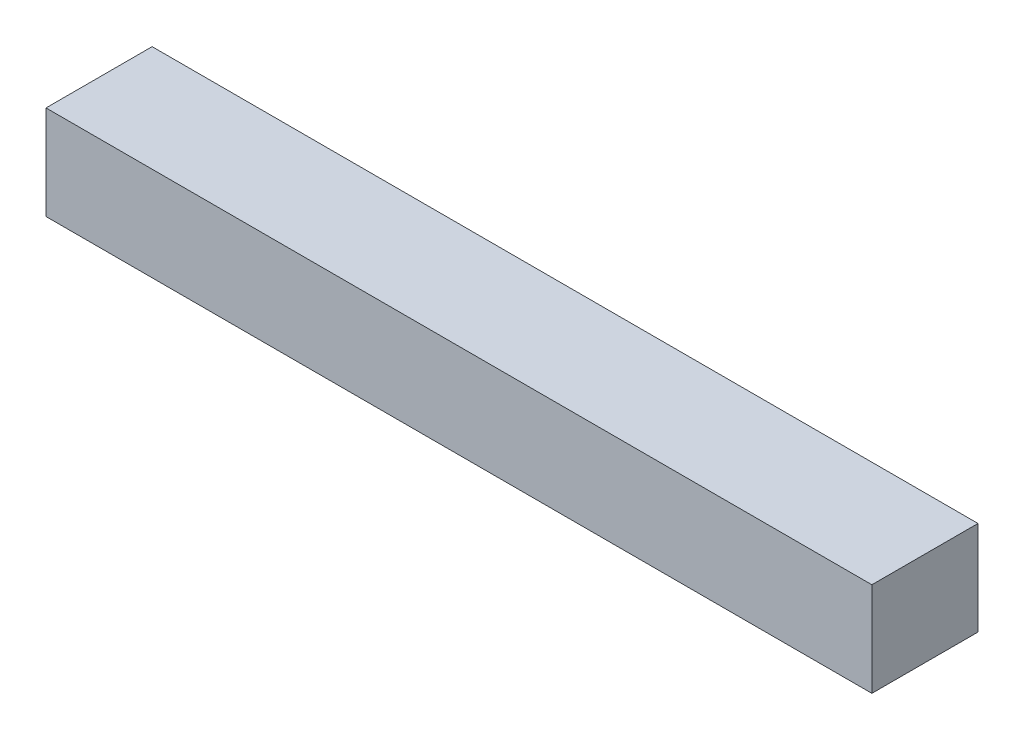
ISO-10303-21;
HEADER;
FILE_DESCRIPTION(('STEP AP214'),'2;1');
FILE_NAME('part.step','',(''),(''),'','','');
FILE_SCHEMA(('AUTOMOTIVE_DESIGN { 1 0 10303 214 1 1 1 1 }'));
ENDSEC;
DATA;
#1=APPLICATION_CONTEXT('core data for automotive mechanical design processes');
#2=APPLICATION_PROTOCOL_DEFINITION('international standard','automotive_design',2000,#1);
#3=PRODUCT_CONTEXT('',#1,'mechanical');
#4=PRODUCT('Part','Part','',(#3));
#5=PRODUCT_RELATED_PRODUCT_CATEGORY('part','',(#4));
#6=PRODUCT_DEFINITION_FORMATION('','',#4);
#7=PRODUCT_DEFINITION_CONTEXT('part definition',#1,'design');
#8=PRODUCT_DEFINITION('design','',#6,#7);
#9=PRODUCT_DEFINITION_SHAPE('','',#8);
#10=(LENGTH_UNIT() NAMED_UNIT(*) SI_UNIT(.MILLI.,.METRE.));
#11=(NAMED_UNIT(*) PLANE_ANGLE_UNIT() SI_UNIT($,.RADIAN.));
#12=(NAMED_UNIT(*) SI_UNIT($,.STERADIAN.) SOLID_ANGLE_UNIT());
#13=UNCERTAINTY_MEASURE_WITH_UNIT(LENGTH_MEASURE(1.E-05),#10,'distance_accuracy_value','');
#14=(GEOMETRIC_REPRESENTATION_CONTEXT(3) GLOBAL_UNCERTAINTY_ASSIGNED_CONTEXT((#13)) GLOBAL_UNIT_ASSIGNED_CONTEXT((#10,
#11,#12)) REPRESENTATION_CONTEXT('',''));
#15=CARTESIAN_POINT('',(0.,0.,0.));
#16=DIRECTION('',(0.,0.,1.));
#17=DIRECTION('',(1.,0.,0.));
#18=AXIS2_PLACEMENT_3D('',#15,#16,#17);
#19=CARTESIAN_POINT('',(-10.5953177257525,9.75,5.53678929765886));
#20=DIRECTION('',(1.,0.,0.));
#21=DIRECTION('',(0.,0.,-1.));
#22=AXIS2_PLACEMENT_3D('',#19,#20,#21);
#23=PLANE('',#22);
#24=DIRECTION('',(0.,0.,1.));
#25=VECTOR('',#24,1.);
#26=CARTESIAN_POINT('',(-10.5953177257525,0.,5.53678929765886));
#27=LINE('',#26,#25);
#28=CARTESIAN_POINT('',(-10.5953177257525,0.,-5.46321070234113));
#29=VERTEX_POINT('',#28);
#30=CARTESIAN_POINT('',(-10.5953177257525,0.,5.53678929765886));
#31=VERTEX_POINT('',#30);
#32=EDGE_CURVE('E107',#29,#31,#27,.T.);
#33=ORIENTED_EDGE('',*,*,#32,.T.);
#34=DIRECTION('',(0.,-1.,0.));
#35=VECTOR('',#34,1.);
#36=CARTESIAN_POINT('',(-10.5953177257525,9.75,5.53678929765886));
#37=LINE('',#36,#35);
#38=CARTESIAN_POINT('',(-10.5953177257525,9.75,5.53678929765886));
#39=VERTEX_POINT('',#38);
#40=EDGE_CURVE('E11',#39,#31,#37,.T.);
#41=ORIENTED_EDGE('',*,*,#40,.F.);
#42=DIRECTION('',(0.,0.,1.));
#43=VECTOR('',#42,1.);
#44=CARTESIAN_POINT('',(-10.5953177257525,9.75,5.53678929765886));
#45=LINE('',#44,#43);
#46=CARTESIAN_POINT('',(-10.5953177257525,9.75,-5.46321070234113));
#47=VERTEX_POINT('',#46);
#48=EDGE_CURVE('E91',#47,#39,#45,.T.);
#49=ORIENTED_EDGE('',*,*,#48,.F.);
#50=DIRECTION('',(0.,-1.,0.));
#51=VECTOR('',#50,1.);
#52=CARTESIAN_POINT('',(-10.5953177257525,9.75,-5.46321070234113));
#53=LINE('',#52,#51);
#54=EDGE_CURVE('E103',#47,#29,#53,.T.);
#55=ORIENTED_EDGE('',*,*,#54,.T.);
#56=EDGE_LOOP('',(#33,#41,#49,#55));
#57=FACE_BOUND('',#56,.T.);
#58=ADVANCED_FACE('F39',(#57),#23,.F.);
#59=CARTESIAN_POINT('',(-10.5953177257525,9.75,5.53678929765886));
#60=DIRECTION('',(0.,0.,-1.));
#61=DIRECTION('',(-1.,0.,0.));
#62=AXIS2_PLACEMENT_3D('',#59,#60,#61);
#63=PLANE('',#62);
#64=DIRECTION('',(1.,0.,0.));
#65=VECTOR('',#64,1.);
#66=CARTESIAN_POINT('',(-10.5953177257525,0.,5.53678929765886));
#67=LINE('',#66,#65);
#68=CARTESIAN_POINT('',(75.0046822742475,0.,5.53678929765886));
#69=VERTEX_POINT('',#68);
#70=EDGE_CURVE('E96',#31,#69,#67,.T.);
#71=ORIENTED_EDGE('',*,*,#70,.T.);
#72=DIRECTION('',(0.,-1.,0.));
#73=VECTOR('',#72,1.);
#74=CARTESIAN_POINT('',(75.0046822742475,9.75,5.53678929765886));
#75=LINE('',#74,#73);
#76=CARTESIAN_POINT('',(75.0046822742475,9.75,5.53678929765886));
#77=VERTEX_POINT('',#76);
#78=EDGE_CURVE('E48',#77,#69,#75,.T.);
#79=ORIENTED_EDGE('',*,*,#78,.F.);
#80=DIRECTION('',(1.,0.,0.));
#81=VECTOR('',#80,1.);
#82=CARTESIAN_POINT('',(-10.5953177257525,9.75,5.53678929765886));
#83=LINE('',#82,#81);
#84=EDGE_CURVE('E86',#39,#77,#83,.T.);
#85=ORIENTED_EDGE('',*,*,#84,.F.);
#86=ORIENTED_EDGE('',*,*,#40,.T.);
#87=EDGE_LOOP('',(#71,#79,#85,#86));
#88=FACE_BOUND('',#87,.T.);
#89=ADVANCED_FACE('F95',(#88),#63,.F.);
#90=CARTESIAN_POINT('',(75.0046822742475,9.75,5.53678929765886));
#91=DIRECTION('',(-1.,0.,0.));
#92=DIRECTION('',(0.,0.,1.));
#93=AXIS2_PLACEMENT_3D('',#90,#91,#92);
#94=PLANE('',#93);
#95=DIRECTION('',(0.,0.,-1.));
#96=VECTOR('',#95,1.);
#97=CARTESIAN_POINT('',(75.0046822742475,0.,5.53678929765886));
#98=LINE('',#97,#96);
#99=CARTESIAN_POINT('',(75.0046822742475,0.,-5.46321070234113));
#100=VERTEX_POINT('',#99);
#101=EDGE_CURVE('E73',#69,#100,#98,.T.);
#102=ORIENTED_EDGE('',*,*,#101,.T.);
#103=DIRECTION('',(0.,-1.,0.));
#104=VECTOR('',#103,1.);
#105=CARTESIAN_POINT('',(75.0046822742475,9.75,-5.46321070234113));
#106=LINE('',#105,#104);
#107=CARTESIAN_POINT('',(75.0046822742475,9.75,-5.46321070234113));
#108=VERTEX_POINT('',#107);
#109=EDGE_CURVE('E98',#108,#100,#106,.T.);
#110=ORIENTED_EDGE('',*,*,#109,.F.);
#111=DIRECTION('',(0.,0.,-1.));
#112=VECTOR('',#111,1.);
#113=CARTESIAN_POINT('',(75.0046822742475,9.75,5.53678929765886));
#114=LINE('',#113,#112);
#115=EDGE_CURVE('E89',#77,#108,#114,.T.);
#116=ORIENTED_EDGE('',*,*,#115,.F.);
#117=ORIENTED_EDGE('',*,*,#78,.T.);
#118=EDGE_LOOP('',(#102,#110,#116,#117));
#119=FACE_BOUND('',#118,.T.);
#120=ADVANCED_FACE('F99',(#119),#94,.F.);
#121=CARTESIAN_POINT('',(-10.5953177257525,9.75,-5.46321070234113));
#122=DIRECTION('',(0.,0.,1.));
#123=DIRECTION('',(1.,0.,0.));
#124=AXIS2_PLACEMENT_3D('',#121,#122,#123);
#125=PLANE('',#124);
#126=DIRECTION('',(-1.,0.,0.));
#127=VECTOR('',#126,1.);
#128=CARTESIAN_POINT('',(-10.5953177257525,0.,-5.46321070234113));
#129=LINE('',#128,#127);
#130=EDGE_CURVE('E79',#100,#29,#129,.T.);
#131=ORIENTED_EDGE('',*,*,#130,.T.);
#132=ORIENTED_EDGE('',*,*,#54,.F.);
#133=DIRECTION('',(-1.,0.,0.));
#134=VECTOR('',#133,1.);
#135=CARTESIAN_POINT('',(-10.5953177257525,9.75,-5.46321070234113));
#136=LINE('',#135,#134);
#137=EDGE_CURVE('E56',#108,#47,#136,.T.);
#138=ORIENTED_EDGE('',*,*,#137,.F.);
#139=ORIENTED_EDGE('',*,*,#109,.T.);
#140=EDGE_LOOP('',(#131,#132,#138,#139));
#141=FACE_BOUND('',#140,.T.);
#142=ADVANCED_FACE('F120',(#141),#125,.F.);
#143=CARTESIAN_POINT('',(0.,9.75,0.));
#144=DIRECTION('',(0.,-1.,0.));
#145=DIRECTION('',(0.,0.,-1.));
#146=AXIS2_PLACEMENT_3D('',#143,#144,#145);
#147=PLANE('',#146);
#148=ORIENTED_EDGE('',*,*,#48,.T.);
#149=ORIENTED_EDGE('',*,*,#84,.T.);
#150=ORIENTED_EDGE('',*,*,#115,.T.);
#151=ORIENTED_EDGE('',*,*,#137,.T.);
#152=EDGE_LOOP('',(#148,#149,#150,#151));
#153=FACE_BOUND('',#152,.T.);
#154=ADVANCED_FACE('F87',(#153),#147,.F.);
#155=CARTESIAN_POINT('',(0.,0.,0.));
#156=DIRECTION('',(0.,-1.,0.));
#157=DIRECTION('',(0.,0.,-1.));
#158=AXIS2_PLACEMENT_3D('',#155,#156,#157);
#159=PLANE('',#158);
#160=ORIENTED_EDGE('',*,*,#32,.F.);
#161=ORIENTED_EDGE('',*,*,#130,.F.);
#162=ORIENTED_EDGE('',*,*,#101,.F.);
#163=ORIENTED_EDGE('',*,*,#70,.F.);
#164=EDGE_LOOP('',(#160,#161,#162,#163));
#165=FACE_BOUND('',#164,.T.);
#166=ADVANCED_FACE('F123',(#165),#159,.T.);
#167=CLOSED_SHELL('',(#58,#89,#120,#142,#154,#166));
#168=MANIFOLD_SOLID_BREP('B2',#167);
#169=ADVANCED_BREP_SHAPE_REPRESENTATION('',(#18,#168),#14);
#170=SHAPE_DEFINITION_REPRESENTATION(#9,#169);
ENDSEC;
END-ISO-10303-21;
